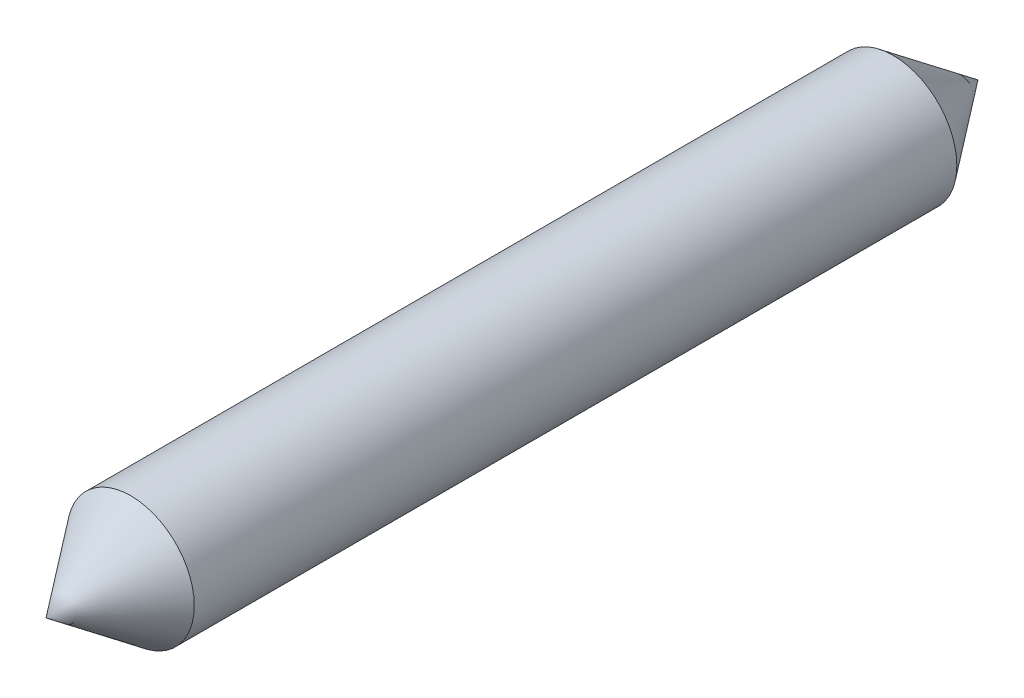
ISO-10303-21;
HEADER;
FILE_DESCRIPTION(('STEP AP214'),'2;1');
FILE_NAME('part.step','',(''),(''),'','','');
FILE_SCHEMA(('AUTOMOTIVE_DESIGN { 1 0 10303 214 1 1 1 1 }'));
ENDSEC;
DATA;
#1=APPLICATION_CONTEXT('core data for automotive mechanical design processes');
#2=APPLICATION_PROTOCOL_DEFINITION('international standard','automotive_design',2000,#1);
#3=PRODUCT_CONTEXT('',#1,'mechanical');
#4=PRODUCT('Part','Part','',(#3));
#5=PRODUCT_RELATED_PRODUCT_CATEGORY('part','',(#4));
#6=PRODUCT_DEFINITION_FORMATION('','',#4);
#7=PRODUCT_DEFINITION_CONTEXT('part definition',#1,'design');
#8=PRODUCT_DEFINITION('design','',#6,#7);
#9=PRODUCT_DEFINITION_SHAPE('','',#8);
#10=(LENGTH_UNIT() NAMED_UNIT(*) SI_UNIT(.MILLI.,.METRE.));
#11=(NAMED_UNIT(*) PLANE_ANGLE_UNIT() SI_UNIT($,.RADIAN.));
#12=(NAMED_UNIT(*) SI_UNIT($,.STERADIAN.) SOLID_ANGLE_UNIT());
#13=UNCERTAINTY_MEASURE_WITH_UNIT(LENGTH_MEASURE(1.E-05),#10,'distance_accuracy_value','');
#14=(GEOMETRIC_REPRESENTATION_CONTEXT(3) GLOBAL_UNCERTAINTY_ASSIGNED_CONTEXT((#13)) GLOBAL_UNIT_ASSIGNED_CONTEXT((#10,
#11,#12)) REPRESENTATION_CONTEXT('',''));
#15=CARTESIAN_POINT('',(0.,0.,0.));
#16=DIRECTION('',(0.,0.,1.));
#17=DIRECTION('',(1.,0.,0.));
#18=AXIS2_PLACEMENT_3D('',#15,#16,#17);
#19=CARTESIAN_POINT('',(0.,0.,5.5));
#20=DIRECTION('',(0.,0.,-1.));
#21=DIRECTION('',(-1.,0.,0.));
#22=AXIS2_PLACEMENT_3D('',#19,#20,#21);
#23=CONICAL_SURFACE('',#22,0.,0.643501108793283);
#24=CARTESIAN_POINT('',(0.,0.,4.5));
#25=DIRECTION('',(0.,0.,1.));
#26=DIRECTION('',(1.,0.,0.));
#27=AXIS2_PLACEMENT_3D('',#24,#25,#26);
#28=CIRCLE('',#27,0.750000000000001);
#29=CARTESIAN_POINT('',(0.750000000000001,0.,4.5));
#30=VERTEX_POINT('',#29);
#31=EDGE_CURVE('E11',#30,#30,#28,.T.);
#32=ORIENTED_EDGE('',*,*,#31,.T.);
#33=EDGE_LOOP('',(#32));
#34=FACE_BOUND('',#33,.T.);
#35=CARTESIAN_POINT('',(0.,0.,5.5));
#36=VERTEX_POINT('',#35);
#37=VERTEX_LOOP('',#36);
#38=FACE_BOUND('',#37,.T.);
#39=ADVANCED_FACE('F35',(#34,#38),#23,.T.);
#40=CARTESIAN_POINT('',(0.,0.,52.1580115267459));
#41=DIRECTION('',(0.,0.,1.));
#42=DIRECTION('',(1.,0.,0.));
#43=AXIS2_PLACEMENT_3D('',#40,#41,#42);
#44=CYLINDRICAL_SURFACE('',#43,0.750000000000001);
#45=CARTESIAN_POINT('',(0.,0.,-4.5));
#46=DIRECTION('',(0.,0.,1.));
#47=DIRECTION('',(1.,0.,0.));
#48=AXIS2_PLACEMENT_3D('',#45,#46,#47);
#49=CIRCLE('',#48,0.750000000000001);
#50=CARTESIAN_POINT('',(0.750000000000001,0.,-4.5));
#51=VERTEX_POINT('',#50);
#52=EDGE_CURVE('E42',#51,#51,#49,.T.);
#53=ORIENTED_EDGE('',*,*,#52,.T.);
#54=EDGE_LOOP('',(#53));
#55=FACE_BOUND('',#54,.T.);
#56=ORIENTED_EDGE('',*,*,#31,.F.);
#57=EDGE_LOOP('',(#56));
#58=FACE_BOUND('',#57,.T.);
#59=ADVANCED_FACE('F49',(#55,#58),#44,.T.);
#60=CARTESIAN_POINT('',(0.,0.,-4.5));
#61=DIRECTION('',(0.,0.,1.));
#62=DIRECTION('',(1.,0.,0.));
#63=AXIS2_PLACEMENT_3D('',#60,#61,#62);
#64=CONICAL_SURFACE('',#63,0.750000000000001,0.643501108793283);
#65=CARTESIAN_POINT('',(0.,0.,-5.5));
#66=VERTEX_POINT('',#65);
#67=VERTEX_LOOP('',#66);
#68=FACE_BOUND('',#67,.T.);
#69=ORIENTED_EDGE('',*,*,#52,.F.);
#70=EDGE_LOOP('',(#69));
#71=FACE_BOUND('',#70,.T.);
#72=ADVANCED_FACE('F54',(#68,#71),#64,.T.);
#73=CLOSED_SHELL('',(#39,#59,#72));
#74=MANIFOLD_SOLID_BREP('B2',#73);
#75=ADVANCED_BREP_SHAPE_REPRESENTATION('',(#18,#74),#14);
#76=SHAPE_DEFINITION_REPRESENTATION(#9,#75);
ENDSEC;
END-ISO-10303-21;
